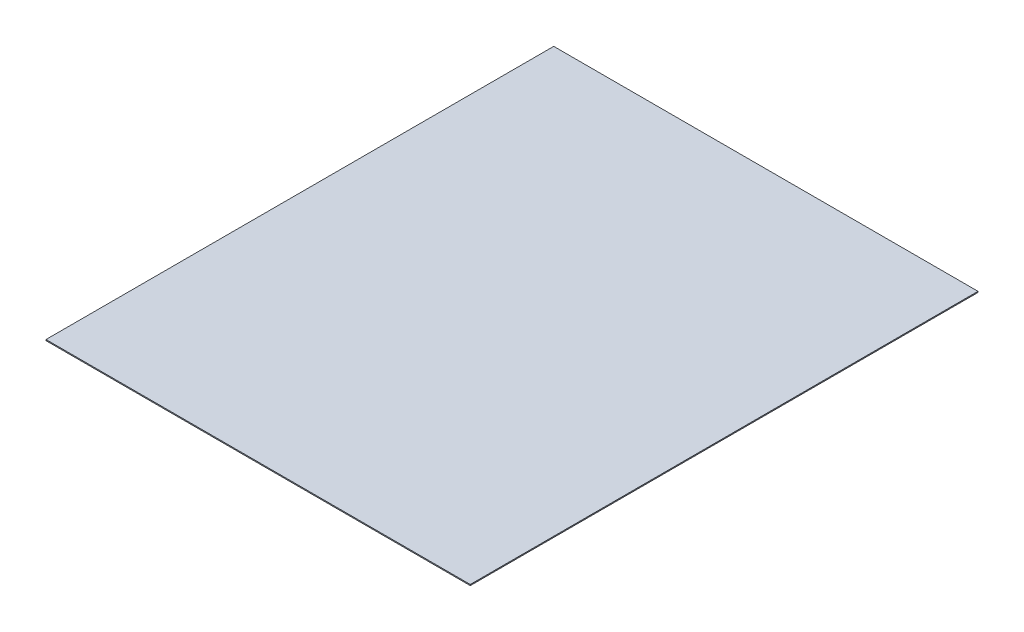
ISO-10303-21;
HEADER;
FILE_DESCRIPTION(('STEP AP214'),'2;1');
FILE_NAME('part.step','',(''),(''),'','','');
FILE_SCHEMA(('AUTOMOTIVE_DESIGN { 1 0 10303 214 1 1 1 1 }'));
ENDSEC;
DATA;
#1=APPLICATION_CONTEXT('core data for automotive mechanical design processes');
#2=APPLICATION_PROTOCOL_DEFINITION('international standard','automotive_design',2000,#1);
#3=PRODUCT_CONTEXT('',#1,'mechanical');
#4=PRODUCT('Part','Part','',(#3));
#5=PRODUCT_RELATED_PRODUCT_CATEGORY('part','',(#4));
#6=PRODUCT_DEFINITION_FORMATION('','',#4);
#7=PRODUCT_DEFINITION_CONTEXT('part definition',#1,'design');
#8=PRODUCT_DEFINITION('design','',#6,#7);
#9=PRODUCT_DEFINITION_SHAPE('','',#8);
#10=(LENGTH_UNIT() NAMED_UNIT(*) SI_UNIT(.MILLI.,.METRE.));
#11=(NAMED_UNIT(*) PLANE_ANGLE_UNIT() SI_UNIT($,.RADIAN.));
#12=(NAMED_UNIT(*) SI_UNIT($,.STERADIAN.) SOLID_ANGLE_UNIT());
#13=UNCERTAINTY_MEASURE_WITH_UNIT(LENGTH_MEASURE(1.E-05),#10,'distance_accuracy_value','');
#14=(GEOMETRIC_REPRESENTATION_CONTEXT(3) GLOBAL_UNCERTAINTY_ASSIGNED_CONTEXT((#13)) GLOBAL_UNIT_ASSIGNED_CONTEXT((#10,
#11,#12)) REPRESENTATION_CONTEXT('',''));
#15=CARTESIAN_POINT('',(0.,0.,0.));
#16=DIRECTION('',(0.,0.,1.));
#17=DIRECTION('',(1.,0.,0.));
#18=AXIS2_PLACEMENT_3D('',#15,#16,#17);
#19=CARTESIAN_POINT('',(0.,270.,0.));
#20=DIRECTION('',(0.,-1.,0.));
#21=DIRECTION('',(0.,0.,-1.));
#22=AXIS2_PLACEMENT_3D('',#19,#20,#21);
#23=PLANE('',#22);
#24=DIRECTION('',(-1.,0.,0.));
#25=VECTOR('',#24,1.);
#26=CARTESIAN_POINT('',(-29.9999999999997,270.,30.));
#27=LINE('',#26,#25);
#28=CARTESIAN_POINT('',(-29.9999999999997,270.,29.9999999999998));
#29=VERTEX_POINT('',#28);
#30=CARTESIAN_POINT('',(-640.,270.,29.9999999999996));
#31=VERTEX_POINT('',#30);
#32=EDGE_CURVE('E57',#29,#31,#27,.T.);
#33=ORIENTED_EDGE('',*,*,#32,.F.);
#34=DIRECTION('',(0.,0.,-1.));
#35=VECTOR('',#34,1.);
#36=CARTESIAN_POINT('',(-30.0000000000001,270.,760.));
#37=LINE('',#36,#35);
#38=CARTESIAN_POINT('',(-29.9999999999999,270.,760.));
#39=VERTEX_POINT('',#38);
#40=EDGE_CURVE('E52',#39,#29,#37,.T.);
#41=ORIENTED_EDGE('',*,*,#40,.F.);
#42=DIRECTION('',(1.,0.,0.));
#43=VECTOR('',#42,1.);
#44=CARTESIAN_POINT('',(-30.0000000000001,270.,760.));
#45=LINE('',#44,#43);
#46=CARTESIAN_POINT('',(-640.,270.,760.));
#47=VERTEX_POINT('',#46);
#48=EDGE_CURVE('E67',#47,#39,#45,.T.);
#49=ORIENTED_EDGE('',*,*,#48,.F.);
#50=DIRECTION('',(0.,0.,1.));
#51=VECTOR('',#50,1.);
#52=CARTESIAN_POINT('',(-640.,270.,760.));
#53=LINE('',#52,#51);
#54=EDGE_CURVE('E19',#31,#47,#53,.T.);
#55=ORIENTED_EDGE('',*,*,#54,.F.);
#56=EDGE_LOOP('',(#33,#41,#49,#55));
#57=FACE_BOUND('',#56,.T.);
#58=ADVANCED_FACE('F16',(#57),#23,.T.);
#59=CARTESIAN_POINT('',(-640.,271.5,760.));
#60=DIRECTION('',(-1.,0.,0.));
#61=DIRECTION('',(0.,0.,1.));
#62=AXIS2_PLACEMENT_3D('',#59,#60,#61);
#63=PLANE('',#62);
#64=DIRECTION('',(0.,0.,-1.));
#65=VECTOR('',#64,1.);
#66=CARTESIAN_POINT('',(-640.,271.5,0.));
#67=LINE('',#66,#65);
#68=CARTESIAN_POINT('',(-640.,271.5,760.));
#69=VERTEX_POINT('',#68);
#70=CARTESIAN_POINT('',(-640.,271.5,29.9999999999996));
#71=VERTEX_POINT('',#70);
#72=EDGE_CURVE('E73',#69,#71,#67,.T.);
#73=ORIENTED_EDGE('',*,*,#72,.T.);
#74=DIRECTION('',(0.,1.,0.));
#75=VECTOR('',#74,1.);
#76=CARTESIAN_POINT('',(-640.,271.5,29.9999999999996));
#77=LINE('',#76,#75);
#78=EDGE_CURVE('E62',#31,#71,#77,.T.);
#79=ORIENTED_EDGE('',*,*,#78,.F.);
#80=ORIENTED_EDGE('',*,*,#54,.T.);
#81=DIRECTION('',(0.,1.,0.));
#82=VECTOR('',#81,1.);
#83=CARTESIAN_POINT('',(-640.,271.5,760.));
#84=LINE('',#83,#82);
#85=EDGE_CURVE('E80',#69,#47,#84,.F.);
#86=ORIENTED_EDGE('',*,*,#85,.F.);
#87=EDGE_LOOP('',(#73,#79,#80,#86));
#88=FACE_BOUND('',#87,.T.);
#89=ADVANCED_FACE('F72',(#88),#63,.T.);
#90=CARTESIAN_POINT('',(-29.9999999999997,271.5,30.));
#91=DIRECTION('',(0.,0.,-1.));
#92=DIRECTION('',(-1.,0.,0.));
#93=AXIS2_PLACEMENT_3D('',#90,#91,#92);
#94=PLANE('',#93);
#95=DIRECTION('',(1.,0.,0.));
#96=VECTOR('',#95,1.);
#97=CARTESIAN_POINT('',(0.,271.5,29.9999999999996));
#98=LINE('',#97,#96);
#99=CARTESIAN_POINT('',(-29.9999999999997,271.5,29.9999999999999));
#100=VERTEX_POINT('',#99);
#101=EDGE_CURVE('E83',#71,#100,#98,.T.);
#102=ORIENTED_EDGE('',*,*,#101,.T.);
#103=DIRECTION('',(0.,1.,0.));
#104=VECTOR('',#103,1.);
#105=CARTESIAN_POINT('',(-29.9999999999997,271.5,29.9999999999999));
#106=LINE('',#105,#104);
#107=EDGE_CURVE('E64',#29,#100,#106,.T.);
#108=ORIENTED_EDGE('',*,*,#107,.F.);
#109=ORIENTED_EDGE('',*,*,#32,.T.);
#110=ORIENTED_EDGE('',*,*,#78,.T.);
#111=EDGE_LOOP('',(#102,#108,#109,#110));
#112=FACE_BOUND('',#111,.T.);
#113=ADVANCED_FACE('F60',(#112),#94,.T.);
#114=CARTESIAN_POINT('',(-30.0000000000001,271.5,760.));
#115=DIRECTION('',(1.,0.,0.));
#116=DIRECTION('',(0.,0.,-1.));
#117=AXIS2_PLACEMENT_3D('',#114,#115,#116);
#118=PLANE('',#117);
#119=DIRECTION('',(0.,0.,-1.));
#120=VECTOR('',#119,1.);
#121=CARTESIAN_POINT('',(-29.9999999999997,271.5,0.));
#122=LINE('',#121,#120);
#123=CARTESIAN_POINT('',(-30.,271.5,760.));
#124=VERTEX_POINT('',#123);
#125=EDGE_CURVE('E25',#100,#124,#122,.F.);
#126=ORIENTED_EDGE('',*,*,#125,.T.);
#127=DIRECTION('',(0.,1.,0.));
#128=VECTOR('',#127,1.);
#129=CARTESIAN_POINT('',(-30.0000000000001,271.5,760.));
#130=LINE('',#129,#128);
#131=EDGE_CURVE('E33',#39,#124,#130,.T.);
#132=ORIENTED_EDGE('',*,*,#131,.F.);
#133=ORIENTED_EDGE('',*,*,#40,.T.);
#134=ORIENTED_EDGE('',*,*,#107,.T.);
#135=EDGE_LOOP('',(#126,#132,#133,#134));
#136=FACE_BOUND('',#135,.T.);
#137=ADVANCED_FACE('F87',(#136),#118,.T.);
#138=CARTESIAN_POINT('',(-30.0000000000001,271.5,760.));
#139=DIRECTION('',(0.,0.,1.));
#140=DIRECTION('',(1.,0.,0.));
#141=AXIS2_PLACEMENT_3D('',#138,#139,#140);
#142=PLANE('',#141);
#143=DIRECTION('',(1.,0.,0.));
#144=VECTOR('',#143,1.);
#145=CARTESIAN_POINT('',(0.,271.5,760.));
#146=LINE('',#145,#144);
#147=EDGE_CURVE('E11',#124,#69,#146,.F.);
#148=ORIENTED_EDGE('',*,*,#147,.T.);
#149=ORIENTED_EDGE('',*,*,#85,.T.);
#150=ORIENTED_EDGE('',*,*,#48,.T.);
#151=ORIENTED_EDGE('',*,*,#131,.T.);
#152=EDGE_LOOP('',(#148,#149,#150,#151));
#153=FACE_BOUND('',#152,.T.);
#154=ADVANCED_FACE('F90',(#153),#142,.T.);
#155=CARTESIAN_POINT('',(0.,271.5,0.));
#156=DIRECTION('',(0.,-1.,0.));
#157=DIRECTION('',(0.,0.,-1.));
#158=AXIS2_PLACEMENT_3D('',#155,#156,#157);
#159=PLANE('',#158);
#160=ORIENTED_EDGE('',*,*,#125,.F.);
#161=ORIENTED_EDGE('',*,*,#101,.F.);
#162=ORIENTED_EDGE('',*,*,#72,.F.);
#163=ORIENTED_EDGE('',*,*,#147,.F.);
#164=EDGE_LOOP('',(#160,#161,#162,#163));
#165=FACE_BOUND('',#164,.T.);
#166=ADVANCED_FACE('F89',(#165),#159,.F.);
#167=CLOSED_SHELL('',(#58,#89,#113,#137,#154,#166));
#168=MANIFOLD_SOLID_BREP('B1',#167);
#169=ADVANCED_BREP_SHAPE_REPRESENTATION('',(#18,#168),#14);
#170=SHAPE_DEFINITION_REPRESENTATION(#9,#169);
ENDSEC;
END-ISO-10303-21;
